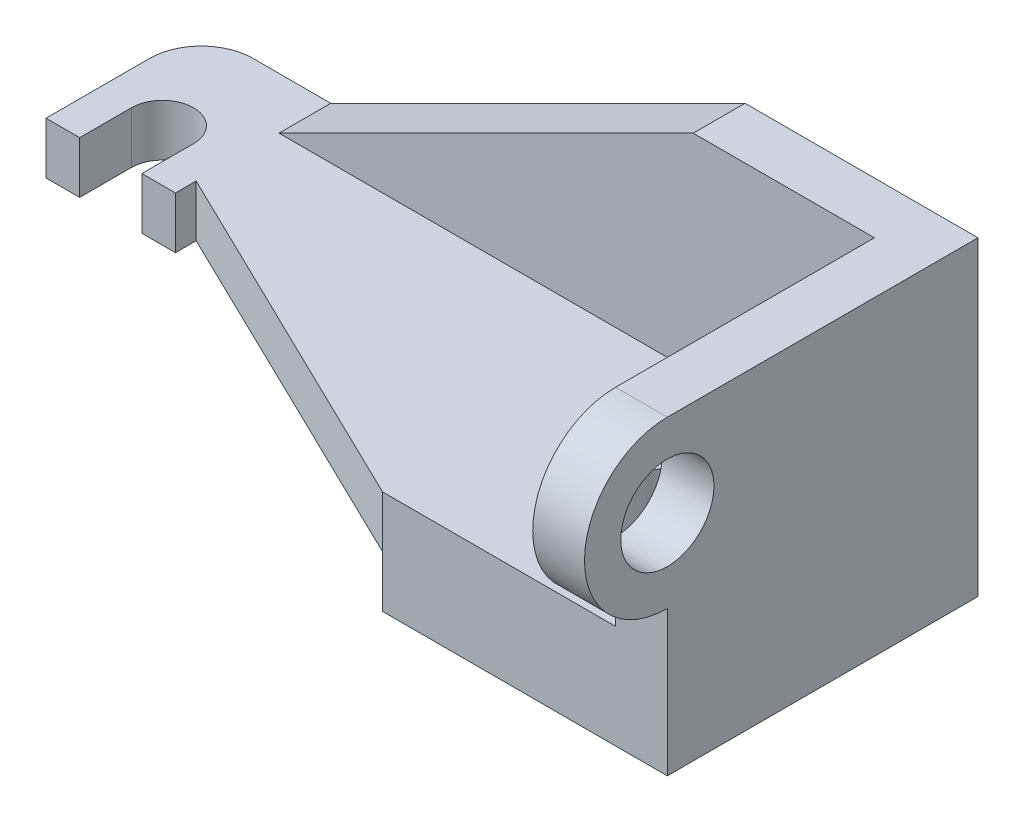
ISO-10303-21;
HEADER;
FILE_DESCRIPTION(('STEP AP214'),'2;1');
FILE_NAME('part.step','',(''),(''),'','','');
FILE_SCHEMA(('AUTOMOTIVE_DESIGN { 1 0 10303 214 1 1 1 1 }'));
ENDSEC;
DATA;
#1=APPLICATION_CONTEXT('core data for automotive mechanical design processes');
#2=APPLICATION_PROTOCOL_DEFINITION('international standard','automotive_design',2000,#1);
#3=PRODUCT_CONTEXT('',#1,'mechanical');
#4=PRODUCT('Part','Part','',(#3));
#5=PRODUCT_RELATED_PRODUCT_CATEGORY('part','',(#4));
#6=PRODUCT_DEFINITION_FORMATION('','',#4);
#7=PRODUCT_DEFINITION_CONTEXT('part definition',#1,'design');
#8=PRODUCT_DEFINITION('design','',#6,#7);
#9=PRODUCT_DEFINITION_SHAPE('','',#8);
#10=(LENGTH_UNIT() NAMED_UNIT(*) SI_UNIT(.MILLI.,.METRE.));
#11=(NAMED_UNIT(*) PLANE_ANGLE_UNIT() SI_UNIT($,.RADIAN.));
#12=(NAMED_UNIT(*) SI_UNIT($,.STERADIAN.) SOLID_ANGLE_UNIT());
#13=UNCERTAINTY_MEASURE_WITH_UNIT(LENGTH_MEASURE(1.E-05),#10,'distance_accuracy_value','');
#14=(GEOMETRIC_REPRESENTATION_CONTEXT(3) GLOBAL_UNCERTAINTY_ASSIGNED_CONTEXT((#13)) GLOBAL_UNIT_ASSIGNED_CONTEXT((#10,
#11,#12)) REPRESENTATION_CONTEXT('',''));
#15=CARTESIAN_POINT('',(0.,0.,0.));
#16=DIRECTION('',(0.,0.,1.));
#17=DIRECTION('',(1.,0.,0.));
#18=AXIS2_PLACEMENT_3D('',#15,#16,#17);
#19=CARTESIAN_POINT('',(-85.,10.,-13.2951499571551));
#20=DIRECTION('',(0.,-1.,0.));
#21=DIRECTION('',(0.,0.,-1.));
#22=AXIS2_PLACEMENT_3D('',#19,#20,#21);
#23=PLANE('',#22);
#24=CARTESIAN_POINT('',(30.,10.,11.7048500428449));
#25=DIRECTION('',(0.,1.,0.));
#26=DIRECTION('',(0.,0.,1.));
#27=AXIS2_PLACEMENT_3D('',#24,#25,#26);
#28=CIRCLE('',#27,9.);
#29=CARTESIAN_POINT('',(30.,10.,20.7048500428449));
#30=VERTEX_POINT('',#29);
#31=EDGE_CURVE('E395',#30,#30,#28,.T.);
#32=ORIENTED_EDGE('',*,*,#31,.F.);
#33=EDGE_LOOP('',(#32));
#34=FACE_BOUND('',#33,.T.);
#35=DIRECTION('',(0.,0.,-1.));
#36=VECTOR('',#35,1.);
#37=CARTESIAN_POINT('',(-70.,10.,-13.2951499571551));
#38=LINE('',#37,#36);
#39=CARTESIAN_POINT('',(-70.,10.,-13.2951499571551));
#40=VERTEX_POINT('',#39);
#41=CARTESIAN_POINT('',(-70.,10.,-23.2951499571551));
#42=VERTEX_POINT('',#41);
#43=EDGE_CURVE('E61',#40,#42,#38,.T.);
#44=ORIENTED_EDGE('',*,*,#43,.T.);
#45=DIRECTION('',(-1.,0.,0.));
#46=VECTOR('',#45,1.);
#47=CARTESIAN_POINT('',(55.,10.,-23.2951499571551));
#48=LINE('',#47,#46);
#49=CARTESIAN_POINT('',(-84.9999999999999,10.,-23.2951499571551));
#50=VERTEX_POINT('',#49);
#51=EDGE_CURVE('E273',#42,#50,#48,.T.);
#52=ORIENTED_EDGE('',*,*,#51,.T.);
#53=CARTESIAN_POINT('',(-85.,10.,-13.2951499571551));
#54=DIRECTION('',(0.,1.,0.));
#55=DIRECTION('',(0.,0.,-1.));
#56=AXIS2_PLACEMENT_3D('',#53,#54,#55);
#57=CIRCLE('',#56,10.);
#58=CARTESIAN_POINT('',(-95.,10.,-13.295149957155));
#59=VERTEX_POINT('',#58);
#60=EDGE_CURVE('E276',#50,#59,#57,.T.);
#61=ORIENTED_EDGE('',*,*,#60,.T.);
#62=DIRECTION('',(0.,0.,1.));
#63=VECTOR('',#62,1.);
#64=CARTESIAN_POINT('',(-95.,10.,-13.295149957155));
#65=LINE('',#64,#63);
#66=CARTESIAN_POINT('',(-95.,10.,6.70485004284489));
#67=VERTEX_POINT('',#66);
#68=EDGE_CURVE('E279',#59,#67,#65,.T.);
#69=ORIENTED_EDGE('',*,*,#68,.T.);
#70=DIRECTION('',(1.,0.,0.));
#71=VECTOR('',#70,1.);
#72=CARTESIAN_POINT('',(-95.,10.,6.70485004284489));
#73=LINE('',#72,#71);
#74=CARTESIAN_POINT('',(-88.5,10.,6.70485004284489));
#75=VERTEX_POINT('',#74);
#76=EDGE_CURVE('E282',#67,#75,#73,.T.);
#77=ORIENTED_EDGE('',*,*,#76,.T.);
#78=DIRECTION('',(0.,0.,-1.));
#79=VECTOR('',#78,1.);
#80=CARTESIAN_POINT('',(-88.5,10.,-3.29514995715511));
#81=LINE('',#80,#79);
#82=CARTESIAN_POINT('',(-88.5,10.,-3.29514995715511));
#83=VERTEX_POINT('',#82);
#84=EDGE_CURVE('E285',#75,#83,#81,.T.);
#85=ORIENTED_EDGE('',*,*,#84,.T.);
#86=CARTESIAN_POINT('',(-82.5,10.,-3.29514995715511));
#87=DIRECTION('',(0.,-1.,0.));
#88=DIRECTION('',(0.,0.,1.));
#89=AXIS2_PLACEMENT_3D('',#86,#87,#88);
#90=CIRCLE('',#89,6.);
#91=CARTESIAN_POINT('',(-76.5,10.,-3.29514995715511));
#92=VERTEX_POINT('',#91);
#93=EDGE_CURVE('E288',#83,#92,#90,.T.);
#94=ORIENTED_EDGE('',*,*,#93,.T.);
#95=DIRECTION('',(0.,0.,1.));
#96=VECTOR('',#95,1.);
#97=CARTESIAN_POINT('',(-76.5,10.,6.70485004284489));
#98=LINE('',#97,#96);
#99=CARTESIAN_POINT('',(-76.5,10.,6.70485004284489));
#100=VERTEX_POINT('',#99);
#101=EDGE_CURVE('E291',#92,#100,#98,.T.);
#102=ORIENTED_EDGE('',*,*,#101,.T.);
#103=DIRECTION('',(1.,0.,0.));
#104=VECTOR('',#103,1.);
#105=CARTESIAN_POINT('',(-76.5,10.,6.70485004284489));
#106=LINE('',#105,#104);
#107=CARTESIAN_POINT('',(-70.,10.,6.70485004284489));
#108=VERTEX_POINT('',#107);
#109=EDGE_CURVE('E294',#100,#108,#106,.T.);
#110=ORIENTED_EDGE('',*,*,#109,.T.);
#111=DIRECTION('',(0.,0.,-1.));
#112=VECTOR('',#111,1.);
#113=CARTESIAN_POINT('',(-70.,10.,6.70485004284489));
#114=LINE('',#113,#112);
#115=CARTESIAN_POINT('',(-70.,10.,2.70485004284489));
#116=VERTEX_POINT('',#115);
#117=EDGE_CURVE('E297',#108,#116,#114,.T.);
#118=ORIENTED_EDGE('',*,*,#117,.T.);
#119=DIRECTION('',(0.899508158575998,0.,0.436903962736913));
#120=VECTOR('',#119,1.);
#121=CARTESIAN_POINT('',(-70.,10.,2.70485004284489));
#122=LINE('',#121,#120);
#123=CARTESIAN_POINT('',(0.,10.,36.7048500428449));
#124=VERTEX_POINT('',#123);
#125=EDGE_CURVE('E264',#116,#124,#122,.T.);
#126=ORIENTED_EDGE('',*,*,#125,.T.);
#127=DIRECTION('',(1.,0.,0.));
#128=VECTOR('',#127,1.);
#129=CARTESIAN_POINT('',(0.,10.,36.7048500428449));
#130=LINE('',#129,#128);
#131=CARTESIAN_POINT('',(45.,10.,36.7048500428449));
#132=VERTEX_POINT('',#131);
#133=EDGE_CURVE('E268',#124,#132,#130,.T.);
#134=ORIENTED_EDGE('',*,*,#133,.T.);
#135=DIRECTION('',(0.,0.,1.));
#136=VECTOR('',#135,1.);
#137=CARTESIAN_POINT('',(45.,10.,-23.2951499571551));
#138=LINE('',#137,#136);
#139=CARTESIAN_POINT('',(45.,10.,-13.2951499571551));
#140=VERTEX_POINT('',#139);
#141=EDGE_CURVE('E233',#140,#132,#138,.T.);
#142=ORIENTED_EDGE('',*,*,#141,.F.);
#143=DIRECTION('',(1.,0.,0.));
#144=VECTOR('',#143,1.);
#145=CARTESIAN_POINT('',(45.,10.,-13.2951499571551));
#146=LINE('',#145,#144);
#147=EDGE_CURVE('E56',#40,#140,#146,.T.);
#148=ORIENTED_EDGE('',*,*,#147,.F.);
#149=EDGE_LOOP('',(#44,#52,#61,#69,#77,#85,#94,#102,#110,#118,#126,#134,#142,#148));
#150=FACE_BOUND('',#149,.T.);
#151=ADVANCED_FACE('F39',(#34,#150),#23,.F.);
#152=CARTESIAN_POINT('',(45.,34.,36.7048500428449));
#153=DIRECTION('',(-1.,0.,0.));
#154=DIRECTION('',(0.,0.,1.));
#155=AXIS2_PLACEMENT_3D('',#152,#153,#154);
#156=PLANE('',#155);
#157=CARTESIAN_POINT('',(45.,34.,36.7048500428449));
#158=DIRECTION('',(-1.,0.,0.));
#159=DIRECTION('',(0.,0.,1.));
#160=AXIS2_PLACEMENT_3D('',#157,#158,#159);
#161=CIRCLE('',#160,9.);
#162=CARTESIAN_POINT('',(45.,34.,45.7048500428449));
#163=VERTEX_POINT('',#162);
#164=EDGE_CURVE('E225',#163,#163,#161,.T.);
#165=ORIENTED_EDGE('',*,*,#164,.F.);
#166=EDGE_LOOP('',(#165));
#167=FACE_BOUND('',#166,.T.);
#168=DIRECTION('',(0.,0.,-1.));
#169=VECTOR('',#168,1.);
#170=CARTESIAN_POINT('',(45.,50.,36.7048500428449));
#171=LINE('',#170,#169);
#172=CARTESIAN_POINT('',(45.,50.,36.7048500428449));
#173=VERTEX_POINT('',#172);
#174=CARTESIAN_POINT('',(45.,50.,-13.2951499571551));
#175=VERTEX_POINT('',#174);
#176=EDGE_CURVE('E243',#173,#175,#171,.T.);
#177=ORIENTED_EDGE('',*,*,#176,.T.);
#178=DIRECTION('',(0.,1.,0.));
#179=VECTOR('',#178,1.);
#180=CARTESIAN_POINT('',(45.,11.1654022151413,-13.2951499571551));
#181=LINE('',#180,#179);
#182=EDGE_CURVE('E202',#140,#175,#181,.T.);
#183=ORIENTED_EDGE('',*,*,#182,.F.);
#184=ORIENTED_EDGE('',*,*,#141,.T.);
#185=DIRECTION('',(0.,1.,0.));
#186=VECTOR('',#185,1.);
#187=CARTESIAN_POINT('',(45.,10.,36.7048500428449));
#188=LINE('',#187,#186);
#189=CARTESIAN_POINT('',(45.,18.,36.7048500428449));
#190=VERTEX_POINT('',#189);
#191=EDGE_CURVE('E236',#132,#190,#188,.T.);
#192=ORIENTED_EDGE('',*,*,#191,.T.);
#193=CARTESIAN_POINT('',(45.,34.,36.7048500428449));
#194=DIRECTION('',(-1.,0.,0.));
#195=DIRECTION('',(0.,0.,1.));
#196=AXIS2_PLACEMENT_3D('',#193,#194,#195);
#197=CIRCLE('',#196,16.);
#198=EDGE_CURVE('E240',#190,#173,#197,.T.);
#199=ORIENTED_EDGE('',*,*,#198,.T.);
#200=EDGE_LOOP('',(#177,#183,#184,#192,#199));
#201=FACE_BOUND('',#200,.T.);
#202=ADVANCED_FACE('F381',(#167,#201),#156,.T.);
#203=CARTESIAN_POINT('',(-70.,10.,2.70485004284489));
#204=DIRECTION('',(0.436903962736913,0.,-0.899508158575998));
#205=DIRECTION('',(-0.899508158575998,0.,-0.436903962736913));
#206=AXIS2_PLACEMENT_3D('',#203,#204,#205);
#207=PLANE('',#206);
#208=DIRECTION('',(0.899508158575998,0.,0.436903962736913));
#209=VECTOR('',#208,1.);
#210=CARTESIAN_POINT('',(-70.,0.,2.70485004284489));
#211=LINE('',#210,#209);
#212=CARTESIAN_POINT('',(-70.,0.,2.70485004284489));
#213=VERTEX_POINT('',#212);
#214=CARTESIAN_POINT('',(0.,0.,36.7048500428449));
#215=VERTEX_POINT('',#214);
#216=EDGE_CURVE('E263',#213,#215,#211,.T.);
#217=ORIENTED_EDGE('',*,*,#216,.T.);
#218=DIRECTION('',(0.,-1.,0.));
#219=VECTOR('',#218,1.);
#220=CARTESIAN_POINT('',(0.,10.,36.7048500428449));
#221=LINE('',#220,#219);
#222=EDGE_CURVE('E11',#124,#215,#221,.T.);
#223=ORIENTED_EDGE('',*,*,#222,.F.);
#224=ORIENTED_EDGE('',*,*,#125,.F.);
#225=DIRECTION('',(0.,-1.,0.));
#226=VECTOR('',#225,1.);
#227=CARTESIAN_POINT('',(-70.,10.,2.70485004284489));
#228=LINE('',#227,#226);
#229=EDGE_CURVE('E300',#116,#213,#228,.T.);
#230=ORIENTED_EDGE('',*,*,#229,.T.);
#231=EDGE_LOOP('',(#217,#223,#224,#230));
#232=FACE_BOUND('',#231,.T.);
#233=ADVANCED_FACE('F41',(#232),#207,.F.);
#234=CARTESIAN_POINT('',(0.,10.,36.7048500428449));
#235=DIRECTION('',(0.,0.,-1.));
#236=DIRECTION('',(-1.,0.,0.));
#237=AXIS2_PLACEMENT_3D('',#234,#235,#236);
#238=PLANE('',#237);
#239=ORIENTED_EDGE('',*,*,#222,.T.);
#240=DIRECTION('',(0.,1.,0.));
#241=VECTOR('',#240,1.);
#242=CARTESIAN_POINT('',(0.,-10.,36.7048500428449));
#243=LINE('',#242,#241);
#244=CARTESIAN_POINT('',(0.,-10.,36.7048500428449));
#245=VERTEX_POINT('',#244);
#246=EDGE_CURVE('E174',#245,#215,#243,.T.);
#247=ORIENTED_EDGE('',*,*,#246,.F.);
#248=DIRECTION('',(-1.,0.,0.));
#249=VECTOR('',#248,1.);
#250=CARTESIAN_POINT('',(55.,-10.,36.7048500428449));
#251=LINE('',#250,#249);
#252=CARTESIAN_POINT('',(55.,-10.,36.7048500428449));
#253=VERTEX_POINT('',#252);
#254=EDGE_CURVE('E182',#253,#245,#251,.T.);
#255=ORIENTED_EDGE('',*,*,#254,.F.);
#256=DIRECTION('',(0.,-1.,0.));
#257=VECTOR('',#256,1.);
#258=CARTESIAN_POINT('',(55.,10.,36.7048500428449));
#259=LINE('',#258,#257);
#260=CARTESIAN_POINT('',(55.,18.,36.7048500428449));
#261=VERTEX_POINT('',#260);
#262=EDGE_CURVE('E49',#261,#253,#259,.T.);
#263=ORIENTED_EDGE('',*,*,#262,.F.);
#264=DIRECTION('',(1.,0.,0.));
#265=VECTOR('',#264,1.);
#266=CARTESIAN_POINT('',(45.,18.,36.7048500428449));
#267=LINE('',#266,#265);
#268=EDGE_CURVE('E259',#190,#261,#267,.T.);
#269=ORIENTED_EDGE('',*,*,#268,.F.);
#270=ORIENTED_EDGE('',*,*,#191,.F.);
#271=ORIENTED_EDGE('',*,*,#133,.F.);
#272=EDGE_LOOP('',(#239,#247,#255,#263,#269,#270,#271));
#273=FACE_BOUND('',#272,.T.);
#274=ADVANCED_FACE('F193',(#273),#238,.F.);
#275=CARTESIAN_POINT('',(55.,10.,36.7048500428449));
#276=DIRECTION('',(-1.,0.,0.));
#277=DIRECTION('',(0.,0.,1.));
#278=AXIS2_PLACEMENT_3D('',#275,#276,#277);
#279=PLANE('',#278);
#280=ORIENTED_EDGE('',*,*,#262,.T.);
#281=DIRECTION('',(0.,0.,1.));
#282=VECTOR('',#281,1.);
#283=CARTESIAN_POINT('',(55.,-10.,-23.2951499571551));
#284=LINE('',#283,#282);
#285=CARTESIAN_POINT('',(55.,-10.,-23.2951499571551));
#286=VERTEX_POINT('',#285);
#287=EDGE_CURVE('E188',#286,#253,#284,.T.);
#288=ORIENTED_EDGE('',*,*,#287,.F.);
#289=DIRECTION('',(0.,-1.,0.));
#290=VECTOR('',#289,1.);
#291=CARTESIAN_POINT('',(55.,10.,-23.2951499571551));
#292=LINE('',#291,#290);
#293=CARTESIAN_POINT('',(55.,50.,-23.2951499571551));
#294=VERTEX_POINT('',#293);
#295=EDGE_CURVE('E364',#294,#286,#292,.T.);
#296=ORIENTED_EDGE('',*,*,#295,.F.);
#297=DIRECTION('',(0.,0.,-1.));
#298=VECTOR('',#297,1.);
#299=CARTESIAN_POINT('',(55.,50.,36.7048500428449));
#300=LINE('',#299,#298);
#301=CARTESIAN_POINT('',(55.,50.,36.7048500428449));
#302=VERTEX_POINT('',#301);
#303=EDGE_CURVE('E237',#302,#294,#300,.T.);
#304=ORIENTED_EDGE('',*,*,#303,.F.);
#305=CARTESIAN_POINT('',(55.,34.,36.7048500428449));
#306=DIRECTION('',(-1.,0.,0.));
#307=DIRECTION('',(0.,0.,1.));
#308=AXIS2_PLACEMENT_3D('',#305,#306,#307);
#309=CIRCLE('',#308,16.);
#310=EDGE_CURVE('E229',#261,#302,#309,.T.);
#311=ORIENTED_EDGE('',*,*,#310,.F.);
#312=EDGE_LOOP('',(#280,#288,#296,#304,#311));
#313=FACE_BOUND('',#312,.T.);
#314=CARTESIAN_POINT('',(55.,34.,36.7048500428449));
#315=DIRECTION('',(-1.,0.,0.));
#316=DIRECTION('',(0.,0.,1.));
#317=AXIS2_PLACEMENT_3D('',#314,#315,#316);
#318=CIRCLE('',#317,9.);
#319=CARTESIAN_POINT('',(55.,34.,45.7048500428449));
#320=VERTEX_POINT('',#319);
#321=EDGE_CURVE('E224',#320,#320,#318,.T.);
#322=ORIENTED_EDGE('',*,*,#321,.T.);
#323=EDGE_LOOP('',(#322));
#324=FACE_BOUND('',#323,.T.);
#325=ADVANCED_FACE('F370',(#313,#324),#279,.F.);
#326=CARTESIAN_POINT('',(55.,10.,-23.2951499571551));
#327=DIRECTION('',(0.,0.,1.));
#328=DIRECTION('',(1.,0.,0.));
#329=AXIS2_PLACEMENT_3D('',#326,#327,#328);
#330=PLANE('',#329);
#331=ORIENTED_EDGE('',*,*,#51,.F.);
#332=DIRECTION('',(-0.894427190999916,-0.447213595499958,0.));
#333=VECTOR('',#332,1.);
#334=CARTESIAN_POINT('',(9.99999999999999,50.,-23.2951499571551));
#335=LINE('',#334,#333);
#336=CARTESIAN_POINT('',(9.99999999999999,50.,-23.2951499571551));
#337=VERTEX_POINT('',#336);
#338=EDGE_CURVE('E197',#337,#42,#335,.T.);
#339=ORIENTED_EDGE('',*,*,#338,.F.);
#340=DIRECTION('',(1.,0.,0.));
#341=VECTOR('',#340,1.);
#342=CARTESIAN_POINT('',(45.,50.,-23.2951499571551));
#343=LINE('',#342,#341);
#344=EDGE_CURVE('E246',#337,#294,#343,.T.);
#345=ORIENTED_EDGE('',*,*,#344,.T.);
#346=ORIENTED_EDGE('',*,*,#295,.T.);
#347=DIRECTION('',(1.,0.,0.));
#348=VECTOR('',#347,1.);
#349=CARTESIAN_POINT('',(0.,-10.,-23.2951499571551));
#350=LINE('',#349,#348);
#351=CARTESIAN_POINT('',(0.,-10.,-23.2951499571551));
#352=VERTEX_POINT('',#351);
#353=EDGE_CURVE('E181',#352,#286,#350,.T.);
#354=ORIENTED_EDGE('',*,*,#353,.F.);
#355=DIRECTION('',(0.,1.,0.));
#356=VECTOR('',#355,1.);
#357=CARTESIAN_POINT('',(0.,-10.,-23.2951499571551));
#358=LINE('',#357,#356);
#359=CARTESIAN_POINT('',(0.,0.,-23.2951499571551));
#360=VERTEX_POINT('',#359);
#361=EDGE_CURVE('E176',#352,#360,#358,.T.);
#362=ORIENTED_EDGE('',*,*,#361,.T.);
#363=DIRECTION('',(-1.,0.,0.));
#364=VECTOR('',#363,1.);
#365=CARTESIAN_POINT('',(55.,0.,-23.2951499571551));
#366=LINE('',#365,#364);
#367=CARTESIAN_POINT('',(-84.9999999999999,0.,-23.2951499571551));
#368=VERTEX_POINT('',#367);
#369=EDGE_CURVE('E303',#360,#368,#366,.T.);
#370=ORIENTED_EDGE('',*,*,#369,.T.);
#371=DIRECTION('',(0.,-1.,0.));
#372=VECTOR('',#371,1.);
#373=CARTESIAN_POINT('',(-84.9999999999999,10.,-23.2951499571551));
#374=LINE('',#373,#372);
#375=EDGE_CURVE('E360',#50,#368,#374,.T.);
#376=ORIENTED_EDGE('',*,*,#375,.F.);
#377=EDGE_LOOP('',(#331,#339,#345,#346,#354,#362,#370,#376));
#378=FACE_BOUND('',#377,.T.);
#379=ADVANCED_FACE('F450',(#378),#330,.F.);
#380=CARTESIAN_POINT('',(-85.,10.,-13.2951499571551));
#381=DIRECTION('',(0.,-1.,0.));
#382=DIRECTION('',(0.,0.,-1.));
#383=AXIS2_PLACEMENT_3D('',#380,#381,#382);
#384=CYLINDRICAL_SURFACE('',#383,10.);
#385=CARTESIAN_POINT('',(-85.,0.,-13.2951499571551));
#386=DIRECTION('',(0.,1.,0.));
#387=DIRECTION('',(0.,0.,-1.));
#388=AXIS2_PLACEMENT_3D('',#385,#386,#387);
#389=CIRCLE('',#388,10.);
#390=CARTESIAN_POINT('',(-95.,0.,-13.295149957155));
#391=VERTEX_POINT('',#390);
#392=EDGE_CURVE('E306',#368,#391,#389,.T.);
#393=ORIENTED_EDGE('',*,*,#392,.T.);
#394=DIRECTION('',(0.,-1.,0.));
#395=VECTOR('',#394,1.);
#396=CARTESIAN_POINT('',(-95.,10.,-13.295149957155));
#397=LINE('',#396,#395);
#398=EDGE_CURVE('E356',#59,#391,#397,.T.);
#399=ORIENTED_EDGE('',*,*,#398,.F.);
#400=ORIENTED_EDGE('',*,*,#60,.F.);
#401=ORIENTED_EDGE('',*,*,#375,.T.);
#402=EDGE_LOOP('',(#393,#399,#400,#401));
#403=FACE_BOUND('',#402,.T.);
#404=ADVANCED_FACE('F446',(#403),#384,.T.);
#405=CARTESIAN_POINT('',(-95.,10.,-13.295149957155));
#406=DIRECTION('',(1.,0.,0.));
#407=DIRECTION('',(0.,0.,-1.));
#408=AXIS2_PLACEMENT_3D('',#405,#406,#407);
#409=PLANE('',#408);
#410=DIRECTION('',(0.,0.,1.));
#411=VECTOR('',#410,1.);
#412=CARTESIAN_POINT('',(-95.,0.,-13.295149957155));
#413=LINE('',#412,#411);
#414=CARTESIAN_POINT('',(-95.,0.,6.70485004284489));
#415=VERTEX_POINT('',#414);
#416=EDGE_CURVE('E309',#391,#415,#413,.T.);
#417=ORIENTED_EDGE('',*,*,#416,.T.);
#418=DIRECTION('',(0.,-1.,0.));
#419=VECTOR('',#418,1.);
#420=CARTESIAN_POINT('',(-95.,10.,6.70485004284489));
#421=LINE('',#420,#419);
#422=EDGE_CURVE('E352',#67,#415,#421,.T.);
#423=ORIENTED_EDGE('',*,*,#422,.F.);
#424=ORIENTED_EDGE('',*,*,#68,.F.);
#425=ORIENTED_EDGE('',*,*,#398,.T.);
#426=EDGE_LOOP('',(#417,#423,#424,#425));
#427=FACE_BOUND('',#426,.T.);
#428=ADVANCED_FACE('F442',(#427),#409,.F.);
#429=CARTESIAN_POINT('',(-95.,10.,6.70485004284489));
#430=DIRECTION('',(0.,0.,-1.));
#431=DIRECTION('',(-1.,0.,0.));
#432=AXIS2_PLACEMENT_3D('',#429,#430,#431);
#433=PLANE('',#432);
#434=DIRECTION('',(1.,0.,0.));
#435=VECTOR('',#434,1.);
#436=CARTESIAN_POINT('',(-95.,0.,6.70485004284489));
#437=LINE('',#436,#435);
#438=CARTESIAN_POINT('',(-88.5,0.,6.70485004284489));
#439=VERTEX_POINT('',#438);
#440=EDGE_CURVE('E312',#415,#439,#437,.T.);
#441=ORIENTED_EDGE('',*,*,#440,.T.);
#442=DIRECTION('',(0.,-1.,0.));
#443=VECTOR('',#442,1.);
#444=CARTESIAN_POINT('',(-88.5,10.,6.70485004284489));
#445=LINE('',#444,#443);
#446=EDGE_CURVE('E348',#75,#439,#445,.T.);
#447=ORIENTED_EDGE('',*,*,#446,.F.);
#448=ORIENTED_EDGE('',*,*,#76,.F.);
#449=ORIENTED_EDGE('',*,*,#422,.T.);
#450=EDGE_LOOP('',(#441,#447,#448,#449));
#451=FACE_BOUND('',#450,.T.);
#452=ADVANCED_FACE('F438',(#451),#433,.F.);
#453=CARTESIAN_POINT('',(-88.5,10.,-3.29514995715511));
#454=DIRECTION('',(-1.,0.,0.));
#455=DIRECTION('',(0.,0.,1.));
#456=AXIS2_PLACEMENT_3D('',#453,#454,#455);
#457=PLANE('',#456);
#458=DIRECTION('',(0.,0.,-1.));
#459=VECTOR('',#458,1.);
#460=CARTESIAN_POINT('',(-88.5,0.,-3.29514995715511));
#461=LINE('',#460,#459);
#462=CARTESIAN_POINT('',(-88.5,0.,-3.29514995715511));
#463=VERTEX_POINT('',#462);
#464=EDGE_CURVE('E315',#439,#463,#461,.T.);
#465=ORIENTED_EDGE('',*,*,#464,.T.);
#466=DIRECTION('',(0.,-1.,0.));
#467=VECTOR('',#466,1.);
#468=CARTESIAN_POINT('',(-88.5,10.,-3.29514995715511));
#469=LINE('',#468,#467);
#470=EDGE_CURVE('E344',#83,#463,#469,.T.);
#471=ORIENTED_EDGE('',*,*,#470,.F.);
#472=ORIENTED_EDGE('',*,*,#84,.F.);
#473=ORIENTED_EDGE('',*,*,#446,.T.);
#474=EDGE_LOOP('',(#465,#471,#472,#473));
#475=FACE_BOUND('',#474,.T.);
#476=ADVANCED_FACE('F434',(#475),#457,.F.);
#477=CARTESIAN_POINT('',(-82.5,10.,-3.29514995715511));
#478=DIRECTION('',(0.,-1.,0.));
#479=DIRECTION('',(0.,0.,-1.));
#480=AXIS2_PLACEMENT_3D('',#477,#478,#479);
#481=CYLINDRICAL_SURFACE('',#480,6.);
#482=CARTESIAN_POINT('',(-82.5,0.,-3.29514995715511));
#483=DIRECTION('',(0.,-1.,0.));
#484=DIRECTION('',(0.,0.,1.));
#485=AXIS2_PLACEMENT_3D('',#482,#483,#484);
#486=CIRCLE('',#485,6.);
#487=CARTESIAN_POINT('',(-76.5,0.,-3.29514995715511));
#488=VERTEX_POINT('',#487);
#489=EDGE_CURVE('E318',#463,#488,#486,.T.);
#490=ORIENTED_EDGE('',*,*,#489,.T.);
#491=DIRECTION('',(0.,-1.,0.));
#492=VECTOR('',#491,1.);
#493=CARTESIAN_POINT('',(-76.5,10.,-3.29514995715511));
#494=LINE('',#493,#492);
#495=EDGE_CURVE('E340',#92,#488,#494,.T.);
#496=ORIENTED_EDGE('',*,*,#495,.F.);
#497=ORIENTED_EDGE('',*,*,#93,.F.);
#498=ORIENTED_EDGE('',*,*,#470,.T.);
#499=EDGE_LOOP('',(#490,#496,#497,#498));
#500=FACE_BOUND('',#499,.T.);
#501=ADVANCED_FACE('F430',(#500),#481,.F.);
#502=CARTESIAN_POINT('',(-76.5,10.,6.70485004284489));
#503=DIRECTION('',(1.,0.,0.));
#504=DIRECTION('',(0.,0.,-1.));
#505=AXIS2_PLACEMENT_3D('',#502,#503,#504);
#506=PLANE('',#505);
#507=DIRECTION('',(0.,0.,1.));
#508=VECTOR('',#507,1.);
#509=CARTESIAN_POINT('',(-76.5,0.,6.70485004284489));
#510=LINE('',#509,#508);
#511=CARTESIAN_POINT('',(-76.5,0.,6.70485004284489));
#512=VERTEX_POINT('',#511);
#513=EDGE_CURVE('E321',#488,#512,#510,.T.);
#514=ORIENTED_EDGE('',*,*,#513,.T.);
#515=DIRECTION('',(0.,-1.,0.));
#516=VECTOR('',#515,1.);
#517=CARTESIAN_POINT('',(-76.5,10.,6.70485004284489));
#518=LINE('',#517,#516);
#519=EDGE_CURVE('E336',#100,#512,#518,.T.);
#520=ORIENTED_EDGE('',*,*,#519,.F.);
#521=ORIENTED_EDGE('',*,*,#101,.F.);
#522=ORIENTED_EDGE('',*,*,#495,.T.);
#523=EDGE_LOOP('',(#514,#520,#521,#522));
#524=FACE_BOUND('',#523,.T.);
#525=ADVANCED_FACE('F426',(#524),#506,.F.);
#526=CARTESIAN_POINT('',(-76.5,10.,6.70485004284489));
#527=DIRECTION('',(0.,0.,-1.));
#528=DIRECTION('',(-1.,0.,0.));
#529=AXIS2_PLACEMENT_3D('',#526,#527,#528);
#530=PLANE('',#529);
#531=DIRECTION('',(1.,0.,0.));
#532=VECTOR('',#531,1.);
#533=CARTESIAN_POINT('',(-76.5,0.,6.70485004284489));
#534=LINE('',#533,#532);
#535=CARTESIAN_POINT('',(-70.,0.,6.70485004284489));
#536=VERTEX_POINT('',#535);
#537=EDGE_CURVE('E324',#512,#536,#534,.T.);
#538=ORIENTED_EDGE('',*,*,#537,.T.);
#539=DIRECTION('',(0.,-1.,0.));
#540=VECTOR('',#539,1.);
#541=CARTESIAN_POINT('',(-70.,10.,6.70485004284489));
#542=LINE('',#541,#540);
#543=EDGE_CURVE('E332',#108,#536,#542,.T.);
#544=ORIENTED_EDGE('',*,*,#543,.F.);
#545=ORIENTED_EDGE('',*,*,#109,.F.);
#546=ORIENTED_EDGE('',*,*,#519,.T.);
#547=EDGE_LOOP('',(#538,#544,#545,#546));
#548=FACE_BOUND('',#547,.T.);
#549=ADVANCED_FACE('F422',(#548),#530,.F.);
#550=CARTESIAN_POINT('',(-70.,10.,6.70485004284489));
#551=DIRECTION('',(-1.,0.,0.));
#552=DIRECTION('',(0.,0.,1.));
#553=AXIS2_PLACEMENT_3D('',#550,#551,#552);
#554=PLANE('',#553);
#555=DIRECTION('',(0.,0.,-1.));
#556=VECTOR('',#555,1.);
#557=CARTESIAN_POINT('',(-70.,0.,6.70485004284489));
#558=LINE('',#557,#556);
#559=EDGE_CURVE('E269',#536,#213,#558,.T.);
#560=ORIENTED_EDGE('',*,*,#559,.T.);
#561=ORIENTED_EDGE('',*,*,#229,.F.);
#562=ORIENTED_EDGE('',*,*,#117,.F.);
#563=ORIENTED_EDGE('',*,*,#543,.T.);
#564=EDGE_LOOP('',(#560,#561,#562,#563));
#565=FACE_BOUND('',#564,.T.);
#566=ADVANCED_FACE('F419',(#565),#554,.F.);
#567=CARTESIAN_POINT('',(-85.,0.,-13.2951499571551));
#568=DIRECTION('',(0.,-1.,0.));
#569=DIRECTION('',(0.,0.,-1.));
#570=AXIS2_PLACEMENT_3D('',#567,#568,#569);
#571=PLANE('',#570);
#572=DIRECTION('',(0.,0.,-1.));
#573=VECTOR('',#572,1.);
#574=CARTESIAN_POINT('',(0.,0.,36.7048500428449));
#575=LINE('',#574,#573);
#576=EDGE_CURVE('E191',#215,#360,#575,.T.);
#577=ORIENTED_EDGE('',*,*,#576,.F.);
#578=ORIENTED_EDGE('',*,*,#216,.F.);
#579=ORIENTED_EDGE('',*,*,#559,.F.);
#580=ORIENTED_EDGE('',*,*,#537,.F.);
#581=ORIENTED_EDGE('',*,*,#513,.F.);
#582=ORIENTED_EDGE('',*,*,#489,.F.);
#583=ORIENTED_EDGE('',*,*,#464,.F.);
#584=ORIENTED_EDGE('',*,*,#440,.F.);
#585=ORIENTED_EDGE('',*,*,#416,.F.);
#586=ORIENTED_EDGE('',*,*,#392,.F.);
#587=ORIENTED_EDGE('',*,*,#369,.F.);
#588=EDGE_LOOP('',(#577,#578,#579,#580,#581,#582,#583,#584,#585,#586,#587));
#589=FACE_BOUND('',#588,.T.);
#590=ADVANCED_FACE('F389',(#589),#571,.T.);
#591=CARTESIAN_POINT('',(45.,34.,36.7048500428449));
#592=DIRECTION('',(1.,0.,0.));
#593=DIRECTION('',(0.,0.,-1.));
#594=AXIS2_PLACEMENT_3D('',#591,#592,#593);
#595=CYLINDRICAL_SURFACE('',#594,16.);
#596=ORIENTED_EDGE('',*,*,#310,.T.);
#597=DIRECTION('',(1.,0.,0.));
#598=VECTOR('',#597,1.);
#599=CARTESIAN_POINT('',(45.,50.,36.7048500428449));
#600=LINE('',#599,#598);
#601=EDGE_CURVE('E255',#173,#302,#600,.T.);
#602=ORIENTED_EDGE('',*,*,#601,.F.);
#603=ORIENTED_EDGE('',*,*,#198,.F.);
#604=ORIENTED_EDGE('',*,*,#268,.T.);
#605=EDGE_LOOP('',(#596,#602,#603,#604));
#606=FACE_BOUND('',#605,.T.);
#607=ADVANCED_FACE('F377',(#606),#595,.T.);
#608=CARTESIAN_POINT('',(45.,50.,36.7048500428449));
#609=DIRECTION('',(0.,-1.,0.));
#610=DIRECTION('',(0.,0.,-1.));
#611=AXIS2_PLACEMENT_3D('',#608,#609,#610);
#612=PLANE('',#611);
#613=ORIENTED_EDGE('',*,*,#303,.T.);
#614=ORIENTED_EDGE('',*,*,#344,.F.);
#615=DIRECTION('',(0.,0.,-1.));
#616=VECTOR('',#615,1.);
#617=CARTESIAN_POINT('',(9.99999999999999,50.,-13.2951499571551));
#618=LINE('',#617,#616);
#619=CARTESIAN_POINT('',(9.99999999999999,50.,-13.2951499571551));
#620=VERTEX_POINT('',#619);
#621=EDGE_CURVE('E220',#620,#337,#618,.T.);
#622=ORIENTED_EDGE('',*,*,#621,.F.);
#623=DIRECTION('',(-1.,0.,0.));
#624=VECTOR('',#623,1.);
#625=CARTESIAN_POINT('',(45.,50.,-13.2951499571551));
#626=LINE('',#625,#624);
#627=EDGE_CURVE('E210',#175,#620,#626,.T.);
#628=ORIENTED_EDGE('',*,*,#627,.F.);
#629=ORIENTED_EDGE('',*,*,#176,.F.);
#630=ORIENTED_EDGE('',*,*,#601,.T.);
#631=EDGE_LOOP('',(#613,#614,#622,#628,#629,#630));
#632=FACE_BOUND('',#631,.T.);
#633=ADVANCED_FACE('F479',(#632),#612,.F.);
#634=CARTESIAN_POINT('',(45.,34.,36.7048500428449));
#635=DIRECTION('',(1.,0.,0.));
#636=DIRECTION('',(0.,0.,-1.));
#637=AXIS2_PLACEMENT_3D('',#634,#635,#636);
#638=CYLINDRICAL_SURFACE('',#637,9.);
#639=ORIENTED_EDGE('',*,*,#164,.T.);
#640=EDGE_LOOP('',(#639));
#641=FACE_BOUND('',#640,.T.);
#642=ORIENTED_EDGE('',*,*,#321,.F.);
#643=EDGE_LOOP('',(#642));
#644=FACE_BOUND('',#643,.T.);
#645=ADVANCED_FACE('F475',(#641,#644),#638,.F.);
#646=CARTESIAN_POINT('',(9.99999999999999,50.,-13.2951499571551));
#647=DIRECTION('',(0.447213595499958,-0.894427190999916,0.));
#648=DIRECTION('',(0.894427190999916,0.447213595499958,0.));
#649=AXIS2_PLACEMENT_3D('',#646,#647,#648);
#650=PLANE('',#649);
#651=ORIENTED_EDGE('',*,*,#338,.T.);
#652=ORIENTED_EDGE('',*,*,#43,.F.);
#653=DIRECTION('',(-0.894427190999916,-0.447213595499958,0.));
#654=VECTOR('',#653,1.);
#655=CARTESIAN_POINT('',(9.99999999999999,50.,-13.2951499571551));
#656=LINE('',#655,#654);
#657=EDGE_CURVE('E213',#620,#40,#656,.T.);
#658=ORIENTED_EDGE('',*,*,#657,.F.);
#659=ORIENTED_EDGE('',*,*,#621,.T.);
#660=EDGE_LOOP('',(#651,#652,#658,#659));
#661=FACE_BOUND('',#660,.T.);
#662=ADVANCED_FACE('F492',(#661),#650,.F.);
#663=CARTESIAN_POINT('',(0.,0.,-13.2951499571551));
#664=DIRECTION('',(0.,0.,-1.));
#665=DIRECTION('',(-1.,0.,0.));
#666=AXIS2_PLACEMENT_3D('',#663,#664,#665);
#667=PLANE('',#666);
#668=ORIENTED_EDGE('',*,*,#182,.T.);
#669=ORIENTED_EDGE('',*,*,#627,.T.);
#670=ORIENTED_EDGE('',*,*,#657,.T.);
#671=ORIENTED_EDGE('',*,*,#147,.T.);
#672=EDGE_LOOP('',(#668,#669,#670,#671));
#673=FACE_BOUND('',#672,.T.);
#674=ADVANCED_FACE('F495',(#673),#667,.F.);
#675=CARTESIAN_POINT('',(0.,-10.,36.7048500428449));
#676=DIRECTION('',(1.,0.,0.));
#677=DIRECTION('',(0.,0.,-1.));
#678=AXIS2_PLACEMENT_3D('',#675,#676,#677);
#679=PLANE('',#678);
#680=ORIENTED_EDGE('',*,*,#576,.T.);
#681=ORIENTED_EDGE('',*,*,#361,.F.);
#682=DIRECTION('',(0.,0.,-1.));
#683=VECTOR('',#682,1.);
#684=CARTESIAN_POINT('',(0.,-10.,36.7048500428449));
#685=LINE('',#684,#683);
#686=EDGE_CURVE('E169',#245,#352,#685,.T.);
#687=ORIENTED_EDGE('',*,*,#686,.F.);
#688=ORIENTED_EDGE('',*,*,#246,.T.);
#689=EDGE_LOOP('',(#680,#681,#687,#688));
#690=FACE_BOUND('',#689,.T.);
#691=ADVANCED_FACE('F172',(#690),#679,.F.);
#692=CARTESIAN_POINT('',(0.,-10.,0.));
#693=DIRECTION('',(0.,-1.,0.));
#694=DIRECTION('',(0.,0.,-1.));
#695=AXIS2_PLACEMENT_3D('',#692,#693,#694);
#696=PLANE('',#695);
#697=CARTESIAN_POINT('',(30.,-10.,11.7048500428449));
#698=DIRECTION('',(0.,-1.,0.));
#699=DIRECTION('',(0.,0.,-1.));
#700=AXIS2_PLACEMENT_3D('',#697,#698,#699);
#701=CIRCLE('',#700,9.);
#702=CARTESIAN_POINT('',(30.,-10.,2.70485004284489));
#703=VERTEX_POINT('',#702);
#704=EDGE_CURVE('E43',#703,#703,#701,.T.);
#705=ORIENTED_EDGE('',*,*,#704,.F.);
#706=EDGE_LOOP('',(#705));
#707=FACE_BOUND('',#706,.T.);
#708=ORIENTED_EDGE('',*,*,#254,.T.);
#709=ORIENTED_EDGE('',*,*,#686,.T.);
#710=ORIENTED_EDGE('',*,*,#353,.T.);
#711=ORIENTED_EDGE('',*,*,#287,.T.);
#712=EDGE_LOOP('',(#708,#709,#710,#711));
#713=FACE_BOUND('',#712,.T.);
#714=ADVANCED_FACE('F186',(#707,#713),#696,.T.);
#715=CARTESIAN_POINT('',(30.,-28.,11.7048500428449));
#716=DIRECTION('',(0.,1.,0.));
#717=DIRECTION('',(0.,0.,1.));
#718=AXIS2_PLACEMENT_3D('',#715,#716,#717);
#719=CYLINDRICAL_SURFACE('',#718,9.);
#720=ORIENTED_EDGE('',*,*,#704,.T.);
#721=EDGE_LOOP('',(#720));
#722=FACE_BOUND('',#721,.T.);
#723=ORIENTED_EDGE('',*,*,#31,.T.);
#724=EDGE_LOOP('',(#723));
#725=FACE_BOUND('',#724,.T.);
#726=ADVANCED_FACE('F405',(#722,#725),#719,.F.);
#727=CLOSED_SHELL('',(#151,#202,#233,#274,#325,#379,#404,#428,#452,#476,#501,#525,#549,#566,
#590,#607,#633,#645,#662,#674,#691,#714,#726));
#728=MANIFOLD_SOLID_BREP('B2',#727);
#729=ADVANCED_BREP_SHAPE_REPRESENTATION('',(#18,#728),#14);
#730=SHAPE_DEFINITION_REPRESENTATION(#9,#729);
ENDSEC;
END-ISO-10303-21;
